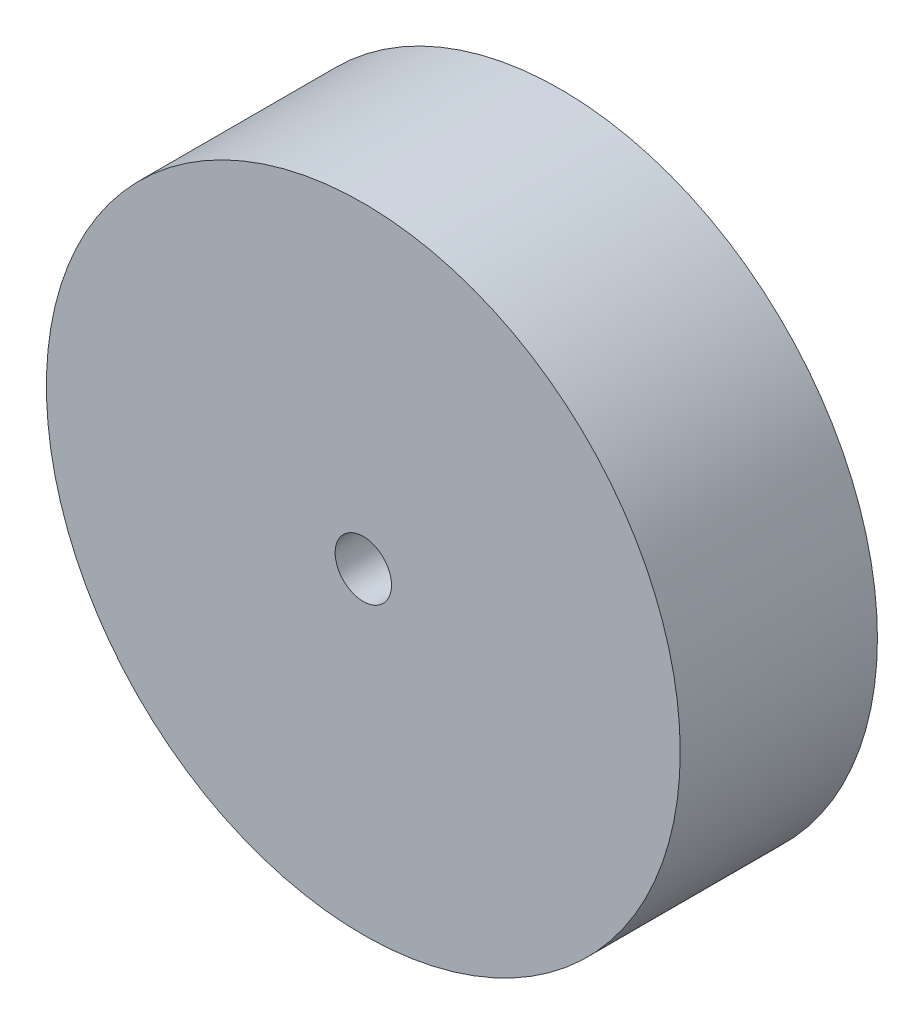
ISO-10303-21;
HEADER;
FILE_DESCRIPTION(('STEP AP214'),'2;1');
FILE_NAME('part.step','',(''),(''),'','','');
FILE_SCHEMA(('AUTOMOTIVE_DESIGN { 1 0 10303 214 1 1 1 1 }'));
ENDSEC;
DATA;
#1=APPLICATION_CONTEXT('core data for automotive mechanical design processes');
#2=APPLICATION_PROTOCOL_DEFINITION('international standard','automotive_design',2000,#1);
#3=PRODUCT_CONTEXT('',#1,'mechanical');
#4=PRODUCT('Part','Part','',(#3));
#5=PRODUCT_RELATED_PRODUCT_CATEGORY('part','',(#4));
#6=PRODUCT_DEFINITION_FORMATION('','',#4);
#7=PRODUCT_DEFINITION_CONTEXT('part definition',#1,'design');
#8=PRODUCT_DEFINITION('design','',#6,#7);
#9=PRODUCT_DEFINITION_SHAPE('','',#8);
#10=(LENGTH_UNIT() NAMED_UNIT(*) SI_UNIT(.MILLI.,.METRE.));
#11=(NAMED_UNIT(*) PLANE_ANGLE_UNIT() SI_UNIT($,.RADIAN.));
#12=(NAMED_UNIT(*) SI_UNIT($,.STERADIAN.) SOLID_ANGLE_UNIT());
#13=UNCERTAINTY_MEASURE_WITH_UNIT(LENGTH_MEASURE(1.E-05),#10,'distance_accuracy_value','');
#14=(GEOMETRIC_REPRESENTATION_CONTEXT(3) GLOBAL_UNCERTAINTY_ASSIGNED_CONTEXT((#13)) GLOBAL_UNIT_ASSIGNED_CONTEXT((#10,
#11,#12)) REPRESENTATION_CONTEXT('',''));
#15=CARTESIAN_POINT('',(0.,0.,0.));
#16=DIRECTION('',(0.,0.,1.));
#17=DIRECTION('',(1.,0.,0.));
#18=AXIS2_PLACEMENT_3D('',#15,#16,#17);
#19=CARTESIAN_POINT('',(0.,0.,1.778));
#20=DIRECTION('',(0.,0.,1.));
#21=DIRECTION('',(1.,0.,0.));
#22=AXIS2_PLACEMENT_3D('',#19,#20,#21);
#23=PLANE('',#22);
#24=CARTESIAN_POINT('',(0.,0.,1.778));
#25=DIRECTION('',(0.,0.,1.));
#26=DIRECTION('',(1.,0.,0.));
#27=AXIS2_PLACEMENT_3D('',#24,#25,#26);
#28=CIRCLE('',#27,2.8575);
#29=CARTESIAN_POINT('',(2.8575,0.,1.778));
#30=VERTEX_POINT('',#29);
#31=EDGE_CURVE('E10',#30,#30,#28,.T.);
#32=ORIENTED_EDGE('',*,*,#31,.T.);
#33=EDGE_LOOP('',(#32));
#34=FACE_BOUND('',#33,.T.);
#35=CARTESIAN_POINT('',(0.,0.,1.778));
#36=DIRECTION('',(0.,0.,1.));
#37=DIRECTION('',(1.,0.,0.));
#38=AXIS2_PLACEMENT_3D('',#35,#36,#37);
#39=CIRCLE('',#38,0.254);
#40=CARTESIAN_POINT('',(0.254,0.,1.778));
#41=VERTEX_POINT('',#40);
#42=EDGE_CURVE('E42',#41,#41,#39,.T.);
#43=ORIENTED_EDGE('',*,*,#42,.F.);
#44=EDGE_LOOP('',(#43));
#45=FACE_BOUND('',#44,.T.);
#46=ADVANCED_FACE('F31',(#34,#45),#23,.T.);
#47=CARTESIAN_POINT('',(0.,0.,0.));
#48=DIRECTION('',(0.,0.,1.));
#49=DIRECTION('',(1.,0.,0.));
#50=AXIS2_PLACEMENT_3D('',#47,#48,#49);
#51=PLANE('',#50);
#52=CARTESIAN_POINT('',(0.,0.,0.));
#53=DIRECTION('',(0.,0.,1.));
#54=DIRECTION('',(1.,0.,0.));
#55=AXIS2_PLACEMENT_3D('',#52,#53,#54);
#56=CIRCLE('',#55,2.8575);
#57=CARTESIAN_POINT('',(2.8575,0.,0.));
#58=VERTEX_POINT('',#57);
#59=EDGE_CURVE('E35',#58,#58,#56,.T.);
#60=ORIENTED_EDGE('',*,*,#59,.F.);
#61=EDGE_LOOP('',(#60));
#62=FACE_BOUND('',#61,.T.);
#63=CARTESIAN_POINT('',(0.,0.,0.));
#64=DIRECTION('',(0.,0.,1.));
#65=DIRECTION('',(1.,0.,0.));
#66=AXIS2_PLACEMENT_3D('',#63,#64,#65);
#67=CIRCLE('',#66,0.254);
#68=CARTESIAN_POINT('',(0.254,0.,0.));
#69=VERTEX_POINT('',#68);
#70=EDGE_CURVE('E44',#69,#69,#67,.T.);
#71=ORIENTED_EDGE('',*,*,#70,.T.);
#72=EDGE_LOOP('',(#71));
#73=FACE_BOUND('',#72,.T.);
#74=ADVANCED_FACE('F54',(#62,#73),#51,.F.);
#75=CARTESIAN_POINT('',(0.,0.,1.778));
#76=DIRECTION('',(0.,0.,-1.));
#77=DIRECTION('',(-1.,0.,0.));
#78=AXIS2_PLACEMENT_3D('',#75,#76,#77);
#79=CYLINDRICAL_SURFACE('',#78,2.8575);
#80=ORIENTED_EDGE('',*,*,#31,.F.);
#81=EDGE_LOOP('',(#80));
#82=FACE_BOUND('',#81,.T.);
#83=ORIENTED_EDGE('',*,*,#59,.T.);
#84=EDGE_LOOP('',(#83));
#85=FACE_BOUND('',#84,.T.);
#86=ADVANCED_FACE('F33',(#82,#85),#79,.T.);
#87=CARTESIAN_POINT('',(0.,0.,1.778));
#88=DIRECTION('',(0.,0.,-1.));
#89=DIRECTION('',(-1.,0.,0.));
#90=AXIS2_PLACEMENT_3D('',#87,#88,#89);
#91=CYLINDRICAL_SURFACE('',#90,0.254);
#92=ORIENTED_EDGE('',*,*,#42,.T.);
#93=EDGE_LOOP('',(#92));
#94=FACE_BOUND('',#93,.T.);
#95=ORIENTED_EDGE('',*,*,#70,.F.);
#96=EDGE_LOOP('',(#95));
#97=FACE_BOUND('',#96,.T.);
#98=ADVANCED_FACE('F50',(#94,#97),#91,.F.);
#99=CLOSED_SHELL('',(#46,#74,#86,#98));
#100=MANIFOLD_SOLID_BREP('B2',#99);
#101=ADVANCED_BREP_SHAPE_REPRESENTATION('',(#18,#100),#14);
#102=SHAPE_DEFINITION_REPRESENTATION(#9,#101);
ENDSEC;
END-ISO-10303-21;
